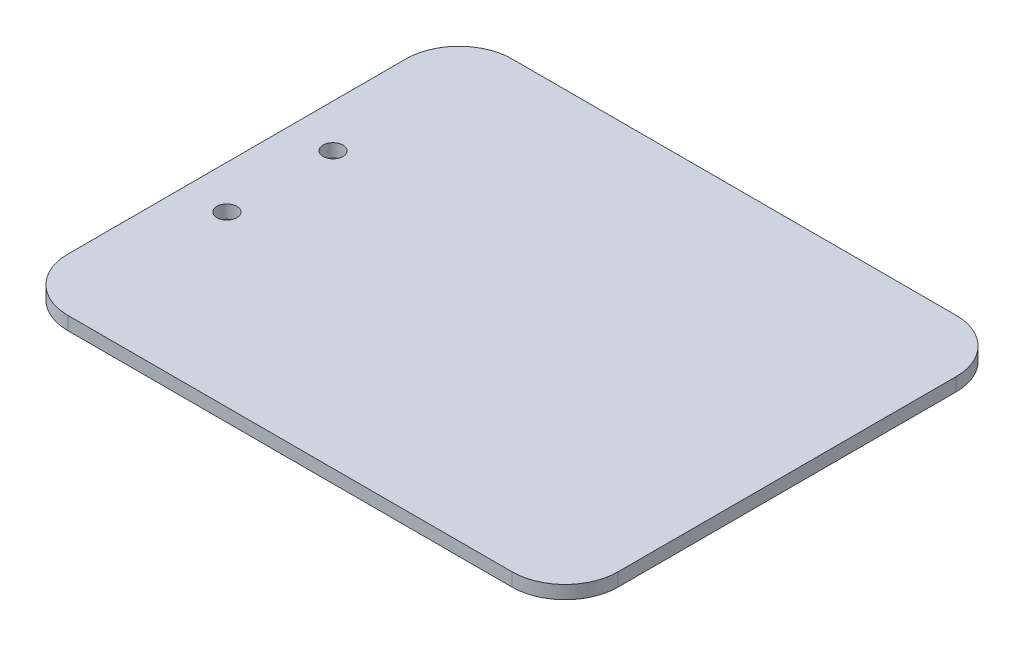
ISO-10303-21;
HEADER;
FILE_DESCRIPTION(('STEP AP214'),'2;1');
FILE_NAME('part.step','',(''),(''),'','','');
FILE_SCHEMA(('AUTOMOTIVE_DESIGN { 1 0 10303 214 1 1 1 1 }'));
ENDSEC;
DATA;
#1=APPLICATION_CONTEXT('core data for automotive mechanical design processes');
#2=APPLICATION_PROTOCOL_DEFINITION('international standard','automotive_design',2000,#1);
#3=PRODUCT_CONTEXT('',#1,'mechanical');
#4=PRODUCT('Part','Part','',(#3));
#5=PRODUCT_RELATED_PRODUCT_CATEGORY('part','',(#4));
#6=PRODUCT_DEFINITION_FORMATION('','',#4);
#7=PRODUCT_DEFINITION_CONTEXT('part definition',#1,'design');
#8=PRODUCT_DEFINITION('design','',#6,#7);
#9=PRODUCT_DEFINITION_SHAPE('','',#8);
#10=(LENGTH_UNIT() NAMED_UNIT(*) SI_UNIT(.MILLI.,.METRE.));
#11=(NAMED_UNIT(*) PLANE_ANGLE_UNIT() SI_UNIT($,.RADIAN.));
#12=(NAMED_UNIT(*) SI_UNIT($,.STERADIAN.) SOLID_ANGLE_UNIT());
#13=UNCERTAINTY_MEASURE_WITH_UNIT(LENGTH_MEASURE(1.E-05),#10,'distance_accuracy_value','');
#14=(GEOMETRIC_REPRESENTATION_CONTEXT(3) GLOBAL_UNCERTAINTY_ASSIGNED_CONTEXT((#13)) GLOBAL_UNIT_ASSIGNED_CONTEXT((#10,
#11,#12)) REPRESENTATION_CONTEXT('',''));
#15=CARTESIAN_POINT('',(0.,0.,0.));
#16=DIRECTION('',(0.,0.,1.));
#17=DIRECTION('',(1.,0.,0.));
#18=AXIS2_PLACEMENT_3D('',#15,#16,#17);
#19=CARTESIAN_POINT('',(8.,2.,-8.));
#20=DIRECTION('',(0.,-1.,0.));
#21=DIRECTION('',(0.,0.,-1.));
#22=AXIS2_PLACEMENT_3D('',#19,#20,#21);
#23=PLANE('',#22);
#24=CARTESIAN_POINT('',(8.,2.,-8.));
#25=DIRECTION('',(0.,1.,0.));
#26=DIRECTION('',(0.,0.,-1.));
#27=AXIS2_PLACEMENT_3D('',#24,#25,#26);
#28=CIRCLE('',#27,8.);
#29=CARTESIAN_POINT('',(0.,2.,-8.00000000000006));
#30=VERTEX_POINT('',#29);
#31=CARTESIAN_POINT('',(8.00000000000006,2.,0.));
#32=VERTEX_POINT('',#31);
#33=EDGE_CURVE('E170',#30,#32,#28,.T.);
#34=ORIENTED_EDGE('',*,*,#33,.T.);
#35=DIRECTION('',(1.,0.,0.));
#36=VECTOR('',#35,1.);
#37=CARTESIAN_POINT('',(8.00000000000006,2.,0.));
#38=LINE('',#37,#36);
#39=CARTESIAN_POINT('',(74.9999999999999,2.,0.));
#40=VERTEX_POINT('',#39);
#41=EDGE_CURVE('E106',#32,#40,#38,.T.);
#42=ORIENTED_EDGE('',*,*,#41,.T.);
#43=CARTESIAN_POINT('',(75.,2.,-8.));
#44=DIRECTION('',(0.,1.,0.));
#45=DIRECTION('',(0.,0.,1.));
#46=AXIS2_PLACEMENT_3D('',#43,#44,#45);
#47=CIRCLE('',#46,8.);
#48=CARTESIAN_POINT('',(83.,2.,-8.00000000000005));
#49=VERTEX_POINT('',#48);
#50=EDGE_CURVE('E191',#40,#49,#47,.T.);
#51=ORIENTED_EDGE('',*,*,#50,.T.);
#52=DIRECTION('',(0.,0.,-1.));
#53=VECTOR('',#52,1.);
#54=CARTESIAN_POINT('',(83.,2.,-8.00000000000006));
#55=LINE('',#54,#53);
#56=CARTESIAN_POINT('',(83.,2.,-59.));
#57=VERTEX_POINT('',#56);
#58=EDGE_CURVE('E205',#49,#57,#55,.T.);
#59=ORIENTED_EDGE('',*,*,#58,.T.);
#60=CARTESIAN_POINT('',(75.,2.,-59.));
#61=DIRECTION('',(0.,1.,0.));
#62=DIRECTION('',(0.,0.,-1.));
#63=AXIS2_PLACEMENT_3D('',#60,#61,#62);
#64=CIRCLE('',#63,8.);
#65=CARTESIAN_POINT('',(74.9999999999999,2.,-67.));
#66=VERTEX_POINT('',#65);
#67=EDGE_CURVE('E125',#57,#66,#64,.T.);
#68=ORIENTED_EDGE('',*,*,#67,.T.);
#69=DIRECTION('',(-1.,0.,0.));
#70=VECTOR('',#69,1.);
#71=CARTESIAN_POINT('',(8.00000000000006,2.,-67.));
#72=LINE('',#71,#70);
#73=CARTESIAN_POINT('',(8.00000000000006,2.,-67.));
#74=VERTEX_POINT('',#73);
#75=EDGE_CURVE('E119',#66,#74,#72,.T.);
#76=ORIENTED_EDGE('',*,*,#75,.T.);
#77=CARTESIAN_POINT('',(8.,2.,-59.));
#78=DIRECTION('',(0.,1.,0.));
#79=DIRECTION('',(0.,0.,-1.));
#80=AXIS2_PLACEMENT_3D('',#77,#78,#79);
#81=CIRCLE('',#80,8.);
#82=CARTESIAN_POINT('',(0.,2.,-59.));
#83=VERTEX_POINT('',#82);
#84=EDGE_CURVE('E123',#74,#83,#81,.T.);
#85=ORIENTED_EDGE('',*,*,#84,.T.);
#86=DIRECTION('',(0.,0.,1.));
#87=VECTOR('',#86,1.);
#88=CARTESIAN_POINT('',(0.,2.,-8.00000000000006));
#89=LINE('',#88,#87);
#90=EDGE_CURVE('E63',#83,#30,#89,.T.);
#91=ORIENTED_EDGE('',*,*,#90,.T.);
#92=EDGE_LOOP('',(#34,#42,#51,#59,#68,#76,#85,#91));
#93=FACE_BOUND('',#92,.T.);
#94=CARTESIAN_POINT('',(6.5,2.,-41.5));
#95=DIRECTION('',(0.,1.,0.));
#96=DIRECTION('',(0.,0.,1.));
#97=AXIS2_PLACEMENT_3D('',#94,#95,#96);
#98=CIRCLE('',#97,1.5);
#99=CARTESIAN_POINT('',(6.5,2.,-40.));
#100=VERTEX_POINT('',#99);
#101=EDGE_CURVE('E152',#100,#100,#98,.T.);
#102=ORIENTED_EDGE('',*,*,#101,.F.);
#103=EDGE_LOOP('',(#102));
#104=FACE_BOUND('',#103,.T.);
#105=CARTESIAN_POINT('',(6.5,2.,-25.5));
#106=DIRECTION('',(0.,1.,0.));
#107=DIRECTION('',(0.,0.,-1.));
#108=AXIS2_PLACEMENT_3D('',#105,#106,#107);
#109=CIRCLE('',#108,1.5);
#110=CARTESIAN_POINT('',(6.5,2.,-27.));
#111=VERTEX_POINT('',#110);
#112=EDGE_CURVE('E219',#111,#111,#109,.T.);
#113=ORIENTED_EDGE('',*,*,#112,.F.);
#114=EDGE_LOOP('',(#113));
#115=FACE_BOUND('',#114,.T.);
#116=ADVANCED_FACE('F45',(#93,#104,#115),#23,.F.);
#117=CARTESIAN_POINT('',(8.,0.,-8.));
#118=DIRECTION('',(0.,-1.,0.));
#119=DIRECTION('',(0.,0.,-1.));
#120=AXIS2_PLACEMENT_3D('',#117,#118,#119);
#121=PLANE('',#120);
#122=CARTESIAN_POINT('',(6.5,0.,-41.5));
#123=DIRECTION('',(0.,1.,0.));
#124=DIRECTION('',(0.,0.,1.));
#125=AXIS2_PLACEMENT_3D('',#122,#123,#124);
#126=CIRCLE('',#125,1.5);
#127=CARTESIAN_POINT('',(6.5,0.,-40.));
#128=VERTEX_POINT('',#127);
#129=EDGE_CURVE('E215',#128,#128,#126,.T.);
#130=ORIENTED_EDGE('',*,*,#129,.T.);
#131=EDGE_LOOP('',(#130));
#132=FACE_BOUND('',#131,.T.);
#133=CARTESIAN_POINT('',(8.,0.,-8.));
#134=DIRECTION('',(0.,1.,0.));
#135=DIRECTION('',(0.,0.,-1.));
#136=AXIS2_PLACEMENT_3D('',#133,#134,#135);
#137=CIRCLE('',#136,8.);
#138=CARTESIAN_POINT('',(0.,0.,-8.00000000000006));
#139=VERTEX_POINT('',#138);
#140=CARTESIAN_POINT('',(8.00000000000006,0.,0.));
#141=VERTEX_POINT('',#140);
#142=EDGE_CURVE('E147',#139,#141,#137,.T.);
#143=ORIENTED_EDGE('',*,*,#142,.F.);
#144=DIRECTION('',(0.,0.,1.));
#145=VECTOR('',#144,1.);
#146=CARTESIAN_POINT('',(0.,0.,-8.00000000000006));
#147=LINE('',#146,#145);
#148=CARTESIAN_POINT('',(0.,0.,-59.));
#149=VERTEX_POINT('',#148);
#150=EDGE_CURVE('E98',#149,#139,#147,.T.);
#151=ORIENTED_EDGE('',*,*,#150,.F.);
#152=CARTESIAN_POINT('',(8.,0.,-59.));
#153=DIRECTION('',(0.,1.,0.));
#154=DIRECTION('',(0.,0.,-1.));
#155=AXIS2_PLACEMENT_3D('',#152,#153,#154);
#156=CIRCLE('',#155,8.);
#157=CARTESIAN_POINT('',(8.00000000000006,0.,-67.));
#158=VERTEX_POINT('',#157);
#159=EDGE_CURVE('E92',#158,#149,#156,.T.);
#160=ORIENTED_EDGE('',*,*,#159,.F.);
#161=DIRECTION('',(-1.,0.,0.));
#162=VECTOR('',#161,1.);
#163=CARTESIAN_POINT('',(8.00000000000006,0.,-67.));
#164=LINE('',#163,#162);
#165=CARTESIAN_POINT('',(74.9999999999999,0.,-67.));
#166=VERTEX_POINT('',#165);
#167=EDGE_CURVE('E134',#166,#158,#164,.T.);
#168=ORIENTED_EDGE('',*,*,#167,.F.);
#169=CARTESIAN_POINT('',(75.,0.,-59.));
#170=DIRECTION('',(0.,1.,0.));
#171=DIRECTION('',(0.,0.,-1.));
#172=AXIS2_PLACEMENT_3D('',#169,#170,#171);
#173=CIRCLE('',#172,8.);
#174=CARTESIAN_POINT('',(83.,0.,-59.));
#175=VERTEX_POINT('',#174);
#176=EDGE_CURVE('E161',#175,#166,#173,.T.);
#177=ORIENTED_EDGE('',*,*,#176,.F.);
#178=DIRECTION('',(0.,0.,-1.));
#179=VECTOR('',#178,1.);
#180=CARTESIAN_POINT('',(83.,0.,-8.00000000000006));
#181=LINE('',#180,#179);
#182=CARTESIAN_POINT('',(83.,0.,-8.00000000000005));
#183=VERTEX_POINT('',#182);
#184=EDGE_CURVE('E158',#183,#175,#181,.T.);
#185=ORIENTED_EDGE('',*,*,#184,.F.);
#186=CARTESIAN_POINT('',(75.,0.,-8.));
#187=DIRECTION('',(0.,1.,0.));
#188=DIRECTION('',(0.,0.,1.));
#189=AXIS2_PLACEMENT_3D('',#186,#187,#188);
#190=CIRCLE('',#189,8.);
#191=CARTESIAN_POINT('',(74.9999999999999,0.,0.));
#192=VERTEX_POINT('',#191);
#193=EDGE_CURVE('E155',#192,#183,#190,.T.);
#194=ORIENTED_EDGE('',*,*,#193,.F.);
#195=DIRECTION('',(1.,0.,0.));
#196=VECTOR('',#195,1.);
#197=CARTESIAN_POINT('',(8.00000000000006,0.,0.));
#198=LINE('',#197,#196);
#199=EDGE_CURVE('E151',#141,#192,#198,.T.);
#200=ORIENTED_EDGE('',*,*,#199,.F.);
#201=EDGE_LOOP('',(#143,#151,#160,#168,#177,#185,#194,#200));
#202=FACE_BOUND('',#201,.T.);
#203=CARTESIAN_POINT('',(6.5,0.,-25.5));
#204=DIRECTION('',(0.,1.,0.));
#205=DIRECTION('',(0.,0.,-1.));
#206=AXIS2_PLACEMENT_3D('',#203,#204,#205);
#207=CIRCLE('',#206,1.5);
#208=CARTESIAN_POINT('',(6.5,0.,-27.));
#209=VERTEX_POINT('',#208);
#210=EDGE_CURVE('E223',#209,#209,#207,.T.);
#211=ORIENTED_EDGE('',*,*,#210,.T.);
#212=EDGE_LOOP('',(#211));
#213=FACE_BOUND('',#212,.T.);
#214=ADVANCED_FACE('F195',(#132,#202,#213),#121,.T.);
#215=CARTESIAN_POINT('',(8.,2.,-8.));
#216=DIRECTION('',(0.,-1.,0.));
#217=DIRECTION('',(0.,0.,-1.));
#218=AXIS2_PLACEMENT_3D('',#215,#216,#217);
#219=CYLINDRICAL_SURFACE('',#218,8.);
#220=ORIENTED_EDGE('',*,*,#142,.T.);
#221=DIRECTION('',(0.,-1.,0.));
#222=VECTOR('',#221,1.);
#223=CARTESIAN_POINT('',(8.00000000000006,2.,0.));
#224=LINE('',#223,#222);
#225=EDGE_CURVE('E11',#32,#141,#224,.T.);
#226=ORIENTED_EDGE('',*,*,#225,.F.);
#227=ORIENTED_EDGE('',*,*,#33,.F.);
#228=DIRECTION('',(0.,-1.,0.));
#229=VECTOR('',#228,1.);
#230=CARTESIAN_POINT('',(0.,2.,-8.00000000000006));
#231=LINE('',#230,#229);
#232=EDGE_CURVE('E143',#30,#139,#231,.T.);
#233=ORIENTED_EDGE('',*,*,#232,.T.);
#234=EDGE_LOOP('',(#220,#226,#227,#233));
#235=FACE_BOUND('',#234,.T.);
#236=ADVANCED_FACE('F47',(#235),#219,.T.);
#237=CARTESIAN_POINT('',(8.00000000000006,2.,0.));
#238=DIRECTION('',(0.,0.,-1.));
#239=DIRECTION('',(-1.,0.,0.));
#240=AXIS2_PLACEMENT_3D('',#237,#238,#239);
#241=PLANE('',#240);
#242=ORIENTED_EDGE('',*,*,#199,.T.);
#243=DIRECTION('',(0.,-1.,0.));
#244=VECTOR('',#243,1.);
#245=CARTESIAN_POINT('',(74.9999999999999,2.,0.));
#246=LINE('',#245,#244);
#247=EDGE_CURVE('E55',#40,#192,#246,.T.);
#248=ORIENTED_EDGE('',*,*,#247,.F.);
#249=ORIENTED_EDGE('',*,*,#41,.F.);
#250=ORIENTED_EDGE('',*,*,#225,.T.);
#251=EDGE_LOOP('',(#242,#248,#249,#250));
#252=FACE_BOUND('',#251,.T.);
#253=ADVANCED_FACE('F257',(#252),#241,.F.);
#254=CARTESIAN_POINT('',(75.,2.,-8.));
#255=DIRECTION('',(0.,-1.,0.));
#256=DIRECTION('',(0.,0.,-1.));
#257=AXIS2_PLACEMENT_3D('',#254,#255,#256);
#258=CYLINDRICAL_SURFACE('',#257,8.);
#259=ORIENTED_EDGE('',*,*,#193,.T.);
#260=DIRECTION('',(0.,-1.,0.));
#261=VECTOR('',#260,1.);
#262=CARTESIAN_POINT('',(83.,2.,-8.00000000000005));
#263=LINE('',#262,#261);
#264=EDGE_CURVE('E181',#49,#183,#263,.T.);
#265=ORIENTED_EDGE('',*,*,#264,.F.);
#266=ORIENTED_EDGE('',*,*,#50,.F.);
#267=ORIENTED_EDGE('',*,*,#247,.T.);
#268=EDGE_LOOP('',(#259,#265,#266,#267));
#269=FACE_BOUND('',#268,.T.);
#270=ADVANCED_FACE('F189',(#269),#258,.T.);
#271=CARTESIAN_POINT('',(83.,2.,-8.00000000000006));
#272=DIRECTION('',(-1.,0.,0.));
#273=DIRECTION('',(0.,0.,1.));
#274=AXIS2_PLACEMENT_3D('',#271,#272,#273);
#275=PLANE('',#274);
#276=ORIENTED_EDGE('',*,*,#184,.T.);
#277=DIRECTION('',(0.,-1.,0.));
#278=VECTOR('',#277,1.);
#279=CARTESIAN_POINT('',(83.,2.,-59.));
#280=LINE('',#279,#278);
#281=EDGE_CURVE('E177',#57,#175,#280,.T.);
#282=ORIENTED_EDGE('',*,*,#281,.F.);
#283=ORIENTED_EDGE('',*,*,#58,.F.);
#284=ORIENTED_EDGE('',*,*,#264,.T.);
#285=EDGE_LOOP('',(#276,#282,#283,#284));
#286=FACE_BOUND('',#285,.T.);
#287=ADVANCED_FACE('F200',(#286),#275,.F.);
#288=CARTESIAN_POINT('',(75.,2.,-59.));
#289=DIRECTION('',(0.,-1.,0.));
#290=DIRECTION('',(0.,0.,-1.));
#291=AXIS2_PLACEMENT_3D('',#288,#289,#290);
#292=CYLINDRICAL_SURFACE('',#291,8.);
#293=ORIENTED_EDGE('',*,*,#176,.T.);
#294=DIRECTION('',(0.,-1.,0.));
#295=VECTOR('',#294,1.);
#296=CARTESIAN_POINT('',(74.9999999999999,2.,-67.));
#297=LINE('',#296,#295);
#298=EDGE_CURVE('E136',#66,#166,#297,.T.);
#299=ORIENTED_EDGE('',*,*,#298,.F.);
#300=ORIENTED_EDGE('',*,*,#67,.F.);
#301=ORIENTED_EDGE('',*,*,#281,.T.);
#302=EDGE_LOOP('',(#293,#299,#300,#301));
#303=FACE_BOUND('',#302,.T.);
#304=ADVANCED_FACE('F203',(#303),#292,.T.);
#305=CARTESIAN_POINT('',(8.00000000000006,2.,-67.));
#306=DIRECTION('',(0.,0.,1.));
#307=DIRECTION('',(1.,0.,0.));
#308=AXIS2_PLACEMENT_3D('',#305,#306,#307);
#309=PLANE('',#308);
#310=ORIENTED_EDGE('',*,*,#167,.T.);
#311=DIRECTION('',(0.,-1.,0.));
#312=VECTOR('',#311,1.);
#313=CARTESIAN_POINT('',(8.00000000000006,2.,-67.));
#314=LINE('',#313,#312);
#315=EDGE_CURVE('E131',#74,#158,#314,.T.);
#316=ORIENTED_EDGE('',*,*,#315,.F.);
#317=ORIENTED_EDGE('',*,*,#75,.F.);
#318=ORIENTED_EDGE('',*,*,#298,.T.);
#319=EDGE_LOOP('',(#310,#316,#317,#318));
#320=FACE_BOUND('',#319,.T.);
#321=ADVANCED_FACE('F132',(#320),#309,.F.);
#322=CARTESIAN_POINT('',(8.,2.,-59.));
#323=DIRECTION('',(0.,-1.,0.));
#324=DIRECTION('',(0.,0.,-1.));
#325=AXIS2_PLACEMENT_3D('',#322,#323,#324);
#326=CYLINDRICAL_SURFACE('',#325,8.);
#327=ORIENTED_EDGE('',*,*,#159,.T.);
#328=DIRECTION('',(0.,-1.,0.));
#329=VECTOR('',#328,1.);
#330=CARTESIAN_POINT('',(0.,2.,-59.));
#331=LINE('',#330,#329);
#332=EDGE_CURVE('E137',#83,#149,#331,.T.);
#333=ORIENTED_EDGE('',*,*,#332,.F.);
#334=ORIENTED_EDGE('',*,*,#84,.F.);
#335=ORIENTED_EDGE('',*,*,#315,.T.);
#336=EDGE_LOOP('',(#327,#333,#334,#335));
#337=FACE_BOUND('',#336,.T.);
#338=ADVANCED_FACE('F139',(#337),#326,.T.);
#339=CARTESIAN_POINT('',(0.,2.,-8.00000000000006));
#340=DIRECTION('',(1.,0.,0.));
#341=DIRECTION('',(0.,0.,-1.));
#342=AXIS2_PLACEMENT_3D('',#339,#340,#341);
#343=PLANE('',#342);
#344=ORIENTED_EDGE('',*,*,#150,.T.);
#345=ORIENTED_EDGE('',*,*,#232,.F.);
#346=ORIENTED_EDGE('',*,*,#90,.F.);
#347=ORIENTED_EDGE('',*,*,#332,.T.);
#348=EDGE_LOOP('',(#344,#345,#346,#347));
#349=FACE_BOUND('',#348,.T.);
#350=ADVANCED_FACE('F245',(#349),#343,.F.);
#351=CARTESIAN_POINT('',(6.5,2.,-41.5));
#352=DIRECTION('',(0.,-1.,0.));
#353=DIRECTION('',(0.,0.,-1.));
#354=AXIS2_PLACEMENT_3D('',#351,#352,#353);
#355=CYLINDRICAL_SURFACE('',#354,1.5);
#356=ORIENTED_EDGE('',*,*,#101,.T.);
#357=EDGE_LOOP('',(#356));
#358=FACE_BOUND('',#357,.T.);
#359=ORIENTED_EDGE('',*,*,#129,.F.);
#360=EDGE_LOOP('',(#359));
#361=FACE_BOUND('',#360,.T.);
#362=ADVANCED_FACE('F242',(#358,#361),#355,.F.);
#363=CARTESIAN_POINT('',(6.5,2.,-25.5));
#364=DIRECTION('',(0.,-1.,0.));
#365=DIRECTION('',(0.,0.,-1.));
#366=AXIS2_PLACEMENT_3D('',#363,#364,#365);
#367=CYLINDRICAL_SURFACE('',#366,1.5);
#368=ORIENTED_EDGE('',*,*,#112,.T.);
#369=EDGE_LOOP('',(#368));
#370=FACE_BOUND('',#369,.T.);
#371=ORIENTED_EDGE('',*,*,#210,.F.);
#372=EDGE_LOOP('',(#371));
#373=FACE_BOUND('',#372,.T.);
#374=ADVANCED_FACE('F231',(#370,#373),#367,.F.);
#375=CLOSED_SHELL('',(#116,#214,#236,#253,#270,#287,#304,#321,#338,#350,#362,#374));
#376=MANIFOLD_SOLID_BREP('B2',#375);
#377=ADVANCED_BREP_SHAPE_REPRESENTATION('',(#18,#376),#14);
#378=SHAPE_DEFINITION_REPRESENTATION(#9,#377);
ENDSEC;
END-ISO-10303-21;
